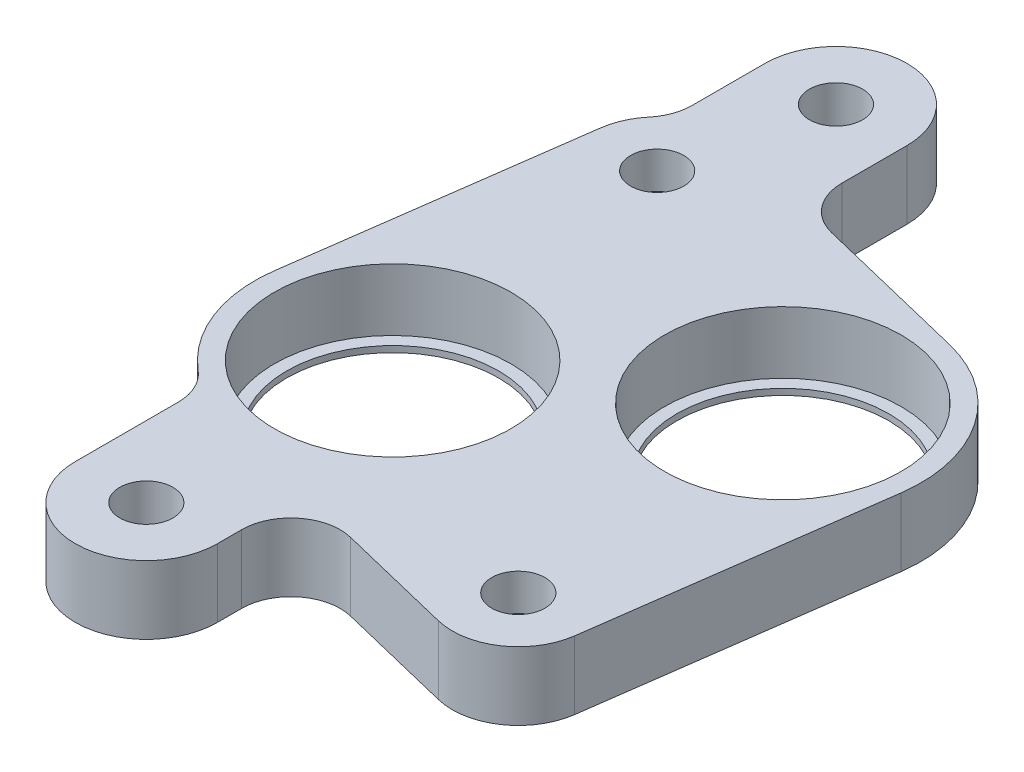
ISO-10303-21;
HEADER;
FILE_DESCRIPTION(('STEP AP214'),'2;1');
FILE_NAME('part.step','',(''),(''),'','','');
FILE_SCHEMA(('AUTOMOTIVE_DESIGN { 1 0 10303 214 1 1 1 1 }'));
ENDSEC;
DATA;
#1=APPLICATION_CONTEXT('core data for automotive mechanical design processes');
#2=APPLICATION_PROTOCOL_DEFINITION('international standard','automotive_design',2000,#1);
#3=PRODUCT_CONTEXT('',#1,'mechanical');
#4=PRODUCT('Part','Part','',(#3));
#5=PRODUCT_RELATED_PRODUCT_CATEGORY('part','',(#4));
#6=PRODUCT_DEFINITION_FORMATION('','',#4);
#7=PRODUCT_DEFINITION_CONTEXT('part definition',#1,'design');
#8=PRODUCT_DEFINITION('design','',#6,#7);
#9=PRODUCT_DEFINITION_SHAPE('','',#8);
#10=(LENGTH_UNIT() NAMED_UNIT(*) SI_UNIT(.MILLI.,.METRE.));
#11=(NAMED_UNIT(*) PLANE_ANGLE_UNIT() SI_UNIT($,.RADIAN.));
#12=(NAMED_UNIT(*) SI_UNIT($,.STERADIAN.) SOLID_ANGLE_UNIT());
#13=UNCERTAINTY_MEASURE_WITH_UNIT(LENGTH_MEASURE(1.E-05),#10,'distance_accuracy_value','');
#14=(GEOMETRIC_REPRESENTATION_CONTEXT(3) GLOBAL_UNCERTAINTY_ASSIGNED_CONTEXT((#13)) GLOBAL_UNIT_ASSIGNED_CONTEXT((#10,
#11,#12)) REPRESENTATION_CONTEXT('',''));
#15=CARTESIAN_POINT('',(0.,0.,0.));
#16=DIRECTION('',(0.,0.,1.));
#17=DIRECTION('',(1.,0.,0.));
#18=AXIS2_PLACEMENT_3D('',#15,#16,#17);
#19=CARTESIAN_POINT('',(-2.06110329687575,53.0765131677119,-19.1105550871349));
#20=DIRECTION('',(0.,-1.,0.));
#21=DIRECTION('',(0.,0.,-1.));
#22=AXIS2_PLACEMENT_3D('',#19,#20,#21);
#23=CYLINDRICAL_SURFACE('',#22,1.7145);
#24=CARTESIAN_POINT('',(-2.06110329687575,4.000000128,-19.1105550871349));
#25=DIRECTION('',(0.,-1.,0.));
#26=DIRECTION('',(0.,0.,-1.));
#27=AXIS2_PLACEMENT_3D('',#24,#25,#26);
#28=CIRCLE('',#27,1.7145);
#29=CARTESIAN_POINT('',(-2.06110329687575,4.000000128,-20.8250550871349));
#30=VERTEX_POINT('',#29);
#31=EDGE_CURVE('E334',#30,#30,#28,.F.);
#32=ORIENTED_EDGE('',*,*,#31,.T.);
#33=EDGE_LOOP('',(#32));
#34=FACE_BOUND('',#33,.T.);
#35=CARTESIAN_POINT('',(-2.06110329687575,1.635125,-19.1105550871349));
#36=DIRECTION('',(0.,-1.,0.));
#37=DIRECTION('',(0.,0.,-1.));
#38=AXIS2_PLACEMENT_3D('',#35,#36,#37);
#39=CIRCLE('',#38,1.7145);
#40=CARTESIAN_POINT('',(-2.06110329687575,1.635125,-20.8250550871349));
#41=VERTEX_POINT('',#40);
#42=EDGE_CURVE('E296',#41,#41,#39,.F.);
#43=ORIENTED_EDGE('',*,*,#42,.F.);
#44=EDGE_LOOP('',(#43));
#45=FACE_BOUND('',#44,.T.);
#46=ADVANCED_FACE('F38',(#34,#45),#23,.F.);
#47=CARTESIAN_POINT('',(17.0236032968758,53.0765131677119,8.92515508713487));
#48=DIRECTION('',(0.,-1.,0.));
#49=DIRECTION('',(0.,0.,-1.));
#50=AXIS2_PLACEMENT_3D('',#47,#48,#49);
#51=CYLINDRICAL_SURFACE('',#50,1.7145);
#52=CARTESIAN_POINT('',(17.0236032968758,4.000000128,8.92515508713487));
#53=DIRECTION('',(0.,-1.,0.));
#54=DIRECTION('',(0.,0.,-1.));
#55=AXIS2_PLACEMENT_3D('',#52,#53,#54);
#56=CIRCLE('',#55,1.7145);
#57=CARTESIAN_POINT('',(17.0236032968758,4.000000128,7.21065508713487));
#58=VERTEX_POINT('',#57);
#59=EDGE_CURVE('E339',#58,#58,#56,.F.);
#60=ORIENTED_EDGE('',*,*,#59,.T.);
#61=EDGE_LOOP('',(#60));
#62=FACE_BOUND('',#61,.T.);
#63=CARTESIAN_POINT('',(17.0236032968758,1.635125,8.92515508713487));
#64=DIRECTION('',(0.,-1.,0.));
#65=DIRECTION('',(0.,0.,-1.));
#66=AXIS2_PLACEMENT_3D('',#63,#64,#65);
#67=CIRCLE('',#66,1.7145);
#68=CARTESIAN_POINT('',(17.0236032968758,1.635125,7.21065508713487));
#69=VERTEX_POINT('',#68);
#70=EDGE_CURVE('E275',#69,#69,#67,.F.);
#71=ORIENTED_EDGE('',*,*,#70,.F.);
#72=EDGE_LOOP('',(#71));
#73=FACE_BOUND('',#72,.T.);
#74=ADVANCED_FACE('F483',(#62,#73),#51,.F.);
#75=CARTESIAN_POINT('',(16.016665053853,53.0765131677119,13.058778875621));
#76=DIRECTION('',(-0.236676047249432,0.,0.971588621103801));
#77=DIRECTION('',(0.971588621103801,0.,0.236676047249432));
#78=AXIS2_PLACEMENT_3D('',#75,#76,#77);
#79=PLANE('',#78);
#80=DIRECTION('',(0.971588621103801,0.,0.236676047249432));
#81=VECTOR('',#80,1.);
#82=CARTESIAN_POINT('',(16.016665053853,4.000000128,13.058778875621));
#83=LINE('',#82,#81);
#84=CARTESIAN_POINT('',(8.50743760526271,4.000000128,11.2295537984374));
#85=VERTEX_POINT('',#84);
#86=CARTESIAN_POINT('',(16.016665053853,4.000000128,13.058778875621));
#87=VERTEX_POINT('',#86);
#88=EDGE_CURVE('E344',#85,#87,#83,.T.);
#89=ORIENTED_EDGE('',*,*,#88,.F.);
#90=DIRECTION('',(0.,-1.,0.));
#91=VECTOR('',#90,1.);
#92=CARTESIAN_POINT('',(8.50743760526271,-0.396874999999998,11.2295537984374));
#93=LINE('',#92,#91);
#94=CARTESIAN_POINT('',(8.50743760526271,-0.396875,11.2295537984374));
#95=VERTEX_POINT('',#94);
#96=EDGE_CURVE('E348',#85,#95,#93,.T.);
#97=ORIENTED_EDGE('',*,*,#96,.T.);
#98=DIRECTION('',(-0.971588621103801,0.,-0.236676047249432));
#99=VECTOR('',#98,1.);
#100=CARTESIAN_POINT('',(16.016665053853,-0.396875,13.058778875621));
#101=LINE('',#100,#99);
#102=CARTESIAN_POINT('',(16.016665053853,-0.396875,13.058778875621));
#103=VERTEX_POINT('',#102);
#104=EDGE_CURVE('E308',#103,#95,#101,.T.);
#105=ORIENTED_EDGE('',*,*,#104,.F.);
#106=DIRECTION('',(0.,-1.,0.));
#107=VECTOR('',#106,1.);
#108=CARTESIAN_POINT('',(16.016665053853,53.0765131677119,13.058778875621));
#109=LINE('',#108,#107);
#110=EDGE_CURVE('E379',#87,#103,#109,.T.);
#111=ORIENTED_EDGE('',*,*,#110,.F.);
#112=EDGE_LOOP('',(#89,#97,#105,#111));
#113=FACE_BOUND('',#112,.T.);
#114=ADVANCED_FACE('F489',(#113),#79,.T.);
#115=CARTESIAN_POINT('',(0.,53.0765131677119,0.));
#116=DIRECTION('',(0.,-1.,0.));
#117=DIRECTION('',(0.,0.,-1.));
#118=AXIS2_PLACEMENT_3D('',#115,#116,#117);
#119=CYLINDRICAL_SURFACE('',#118,8.896999986);
#120=CARTESIAN_POINT('',(0.,-0.396875,0.));
#121=DIRECTION('',(0.,-1.,0.));
#122=DIRECTION('',(0.,0.,-1.));
#123=AXIS2_PLACEMENT_3D('',#120,#121,#122);
#124=CIRCLE('',#123,8.896999986);
#125=CARTESIAN_POINT('',(-5.71612436047576,-0.396875,6.8178098423511));
#126=VERTEX_POINT('',#125);
#127=CARTESIAN_POINT('',(-8.81423844655279,-0.396875,-1.21070614031425));
#128=VERTEX_POINT('',#127);
#129=EDGE_CURVE('E312',#126,#128,#124,.T.);
#130=ORIENTED_EDGE('',*,*,#129,.F.);
#131=DIRECTION('',(0.,-1.,0.));
#132=VECTOR('',#131,1.);
#133=CARTESIAN_POINT('',(-5.71612436047576,53.0765131677119,6.8178098423511));
#134=LINE('',#133,#132);
#135=CARTESIAN_POINT('',(-5.71612436047576,4.000000128,6.8178098423511));
#136=VERTEX_POINT('',#135);
#137=EDGE_CURVE('E420',#126,#136,#134,.F.);
#138=ORIENTED_EDGE('',*,*,#137,.T.);
#139=CARTESIAN_POINT('',(0.,4.000000128,0.));
#140=DIRECTION('',(0.,-1.,0.));
#141=DIRECTION('',(0.,0.,-1.));
#142=AXIS2_PLACEMENT_3D('',#139,#140,#141);
#143=CIRCLE('',#142,8.896999986);
#144=CARTESIAN_POINT('',(-8.81423844655279,4.000000128,-1.21070614031426));
#145=VERTEX_POINT('',#144);
#146=EDGE_CURVE('E352',#145,#136,#143,.F.);
#147=ORIENTED_EDGE('',*,*,#146,.F.);
#148=DIRECTION('',(0.,-1.,0.));
#149=VECTOR('',#148,1.);
#150=CARTESIAN_POINT('',(-8.81423844655279,53.0765131677119,-1.21070614031426));
#151=LINE('',#150,#149);
#152=EDGE_CURVE('E395',#145,#128,#151,.T.);
#153=ORIENTED_EDGE('',*,*,#152,.T.);
#154=EDGE_LOOP('',(#130,#138,#147,#153));
#155=FACE_BOUND('',#154,.T.);
#156=ADVANCED_FACE('F524',(#155),#119,.T.);
#157=CARTESIAN_POINT('',(-6.27602715096902,53.0765131677119,-19.6895085863));
#158=DIRECTION('',(-0.990697815041313,0.,-0.136080267755354));
#159=DIRECTION('',(-0.136080267755354,0.,0.990697815041313));
#160=AXIS2_PLACEMENT_3D('',#157,#158,#159);
#161=PLANE('',#160);
#162=DIRECTION('',(-0.136080267755354,0.,0.990697815041313));
#163=VECTOR('',#162,1.);
#164=CARTESIAN_POINT('',(-6.27602715096902,4.000000128,-19.6895085863));
#165=LINE('',#164,#163);
#166=CARTESIAN_POINT('',(-6.27602715096902,4.000000128,-19.6895085863));
#167=VERTEX_POINT('',#166);
#168=EDGE_CURVE('E356',#167,#145,#165,.T.);
#169=ORIENTED_EDGE('',*,*,#168,.F.);
#170=DIRECTION('',(0.,-1.,0.));
#171=VECTOR('',#170,1.);
#172=CARTESIAN_POINT('',(-6.27602715096902,53.0765131677119,-19.6895085863));
#173=LINE('',#172,#171);
#174=CARTESIAN_POINT('',(-6.27602715096902,-0.396875,-19.6895085863));
#175=VERTEX_POINT('',#174);
#176=EDGE_CURVE('E392',#167,#175,#173,.T.);
#177=ORIENTED_EDGE('',*,*,#176,.T.);
#178=DIRECTION('',(0.136080267755353,0.,-0.990697815041313));
#179=VECTOR('',#178,1.);
#180=CARTESIAN_POINT('',(-8.81423844655279,-0.396875,-1.21070614031425));
#181=LINE('',#180,#179);
#182=EDGE_CURVE('E315',#128,#175,#181,.T.);
#183=ORIENTED_EDGE('',*,*,#182,.F.);
#184=ORIENTED_EDGE('',*,*,#152,.F.);
#185=EDGE_LOOP('',(#169,#177,#183,#184));
#186=FACE_BOUND('',#185,.T.);
#187=ADVANCED_FACE('F520',(#186),#161,.T.);
#188=CARTESIAN_POINT('',(-2.06110329687575,53.0765131677119,-19.1105550871349));
#189=DIRECTION('',(0.,-1.,0.));
#190=DIRECTION('',(0.,0.,-1.));
#191=AXIS2_PLACEMENT_3D('',#188,#189,#190);
#192=CYLINDRICAL_SURFACE('',#191,4.2545);
#193=CARTESIAN_POINT('',(-2.06110329687575,4.000000128,-19.1105550871349));
#194=DIRECTION('',(0.,-1.,0.));
#195=DIRECTION('',(0.,0.,-1.));
#196=AXIS2_PLACEMENT_3D('',#193,#194,#195);
#197=CIRCLE('',#196,4.2545);
#198=CARTESIAN_POINT('',(-5.32227839525858,4.000000128,-21.8428631275446));
#199=VERTEX_POINT('',#198);
#200=EDGE_CURVE('E360',#199,#167,#197,.F.);
#201=ORIENTED_EDGE('',*,*,#200,.F.);
#202=DIRECTION('',(0.,-1.,0.));
#203=VECTOR('',#202,1.);
#204=CARTESIAN_POINT('',(-5.32227839525858,53.0765131677119,-21.8428631275446));
#205=LINE('',#204,#203);
#206=CARTESIAN_POINT('',(-5.32227839525858,-0.396875,-21.8428631275446));
#207=VERTEX_POINT('',#206);
#208=EDGE_CURVE('E429',#199,#207,#205,.T.);
#209=ORIENTED_EDGE('',*,*,#208,.T.);
#210=CARTESIAN_POINT('',(-2.06110329687575,-0.396875,-19.1105550871349));
#211=DIRECTION('',(0.,-1.,0.));
#212=DIRECTION('',(0.,0.,-1.));
#213=AXIS2_PLACEMENT_3D('',#210,#211,#212);
#214=CIRCLE('',#213,4.2545);
#215=EDGE_CURVE('E319',#175,#207,#214,.T.);
#216=ORIENTED_EDGE('',*,*,#215,.F.);
#217=ORIENTED_EDGE('',*,*,#176,.F.);
#218=EDGE_LOOP('',(#201,#209,#216,#217));
#219=FACE_BOUND('',#218,.T.);
#220=ADVANCED_FACE('F516',(#219),#192,.T.);
#221=CARTESIAN_POINT('',(17.0682067890647,53.0765131677119,-18.8296239483583));
#222=DIRECTION('',(0.236676047249432,0.,-0.971588621103801));
#223=DIRECTION('',(-0.971588621103801,0.,-0.236676047249432));
#224=AXIS2_PLACEMENT_3D('',#221,#222,#223);
#225=PLANE('',#224);
#226=DIRECTION('',(0.971588621103801,0.,0.236676047249431));
#227=VECTOR('',#226,1.);
#228=CARTESIAN_POINT('',(-1.05416505385305,-0.396875,-23.244178875621));
#229=LINE('',#228,#227);
#230=CARTESIAN_POINT('',(7.00454470522883,-0.396875,-21.2811015708013));
#231=VERTEX_POINT('',#230);
#232=CARTESIAN_POINT('',(17.0682067890647,-0.396875,-18.8296239483583));
#233=VERTEX_POINT('',#232);
#234=EDGE_CURVE('E322',#231,#233,#229,.T.);
#235=ORIENTED_EDGE('',*,*,#234,.F.);
#236=DIRECTION('',(0.,-1.,0.));
#237=VECTOR('',#236,1.);
#238=CARTESIAN_POINT('',(7.00454470522883,4.000000128,-21.2811015708013));
#239=LINE('',#238,#237);
#240=CARTESIAN_POINT('',(7.00454470522883,4.000000128,-21.2811015708013));
#241=VERTEX_POINT('',#240);
#242=EDGE_CURVE('E427',#231,#241,#239,.F.);
#243=ORIENTED_EDGE('',*,*,#242,.T.);
#244=DIRECTION('',(-0.971588621103801,0.,-0.236676047249432));
#245=VECTOR('',#244,1.);
#246=CARTESIAN_POINT('',(17.0682067890647,4.000000128,-18.8296239483583));
#247=LINE('',#246,#245);
#248=CARTESIAN_POINT('',(17.0682067890647,4.000000128,-18.8296239483583));
#249=VERTEX_POINT('',#248);
#250=EDGE_CURVE('E363',#249,#241,#247,.T.);
#251=ORIENTED_EDGE('',*,*,#250,.F.);
#252=DIRECTION('',(0.,-1.,0.));
#253=VECTOR('',#252,1.);
#254=CARTESIAN_POINT('',(17.0682067890647,53.0765131677119,-18.8296239483583));
#255=LINE('',#254,#253);
#256=EDGE_CURVE('E388',#249,#233,#255,.T.);
#257=ORIENTED_EDGE('',*,*,#256,.T.);
#258=EDGE_LOOP('',(#235,#243,#251,#257));
#259=FACE_BOUND('',#258,.T.);
#260=ADVANCED_FACE('F512',(#259),#225,.T.);
#261=CARTESIAN_POINT('',(14.9625,53.0765131677119,-10.1854));
#262=DIRECTION('',(0.,-1.,0.));
#263=DIRECTION('',(0.,0.,-1.));
#264=AXIS2_PLACEMENT_3D('',#261,#262,#263);
#265=CYLINDRICAL_SURFACE('',#264,8.896999986);
#266=CARTESIAN_POINT('',(14.9625,4.000000128,-10.1854));
#267=DIRECTION('',(0.,-1.,0.));
#268=DIRECTION('',(0.,0.,-1.));
#269=AXIS2_PLACEMENT_3D('',#266,#267,#268);
#270=CIRCLE('',#269,8.896999986);
#271=CARTESIAN_POINT('',(23.7767384465528,4.000000128,-8.97469385968575));
#272=VERTEX_POINT('',#271);
#273=EDGE_CURVE('E367',#272,#249,#270,.F.);
#274=ORIENTED_EDGE('',*,*,#273,.F.);
#275=DIRECTION('',(0.,-1.,0.));
#276=VECTOR('',#275,1.);
#277=CARTESIAN_POINT('',(23.7767384465528,53.0765131677119,-8.97469385968575));
#278=LINE('',#277,#276);
#279=CARTESIAN_POINT('',(23.7767384465528,-0.396875,-8.97469385968575));
#280=VERTEX_POINT('',#279);
#281=EDGE_CURVE('E385',#272,#280,#278,.T.);
#282=ORIENTED_EDGE('',*,*,#281,.T.);
#283=CARTESIAN_POINT('',(14.9625,-0.396875,-10.1854));
#284=DIRECTION('',(0.,-1.,0.));
#285=DIRECTION('',(0.,0.,-1.));
#286=AXIS2_PLACEMENT_3D('',#283,#284,#285);
#287=CIRCLE('',#286,8.896999986);
#288=EDGE_CURVE('E325',#233,#280,#287,.T.);
#289=ORIENTED_EDGE('',*,*,#288,.F.);
#290=ORIENTED_EDGE('',*,*,#256,.F.);
#291=EDGE_LOOP('',(#274,#282,#289,#290));
#292=FACE_BOUND('',#291,.T.);
#293=ADVANCED_FACE('F508',(#292),#265,.T.);
#294=CARTESIAN_POINT('',(21.238527150969,53.0765131677119,9.50410858630002));
#295=DIRECTION('',(0.990697815041313,0.,0.136080267755353));
#296=DIRECTION('',(0.136080267755353,0.,-0.990697815041313));
#297=AXIS2_PLACEMENT_3D('',#294,#295,#296);
#298=PLANE('',#297);
#299=DIRECTION('',(0.136080267755353,0.,-0.990697815041313));
#300=VECTOR('',#299,1.);
#301=CARTESIAN_POINT('',(21.238527150969,4.000000128,9.50410858630002));
#302=LINE('',#301,#300);
#303=CARTESIAN_POINT('',(21.238527150969,4.000000128,9.50410858630002));
#304=VERTEX_POINT('',#303);
#305=EDGE_CURVE('E370',#304,#272,#302,.T.);
#306=ORIENTED_EDGE('',*,*,#305,.F.);
#307=DIRECTION('',(0.,-1.,0.));
#308=VECTOR('',#307,1.);
#309=CARTESIAN_POINT('',(21.238527150969,53.0765131677119,9.50410858630002));
#310=LINE('',#309,#308);
#311=CARTESIAN_POINT('',(21.238527150969,-0.396875,9.50410858630002));
#312=VERTEX_POINT('',#311);
#313=EDGE_CURVE('E357',#304,#312,#310,.T.);
#314=ORIENTED_EDGE('',*,*,#313,.T.);
#315=DIRECTION('',(-0.136080267755353,0.,0.990697815041313));
#316=VECTOR('',#315,1.);
#317=CARTESIAN_POINT('',(23.7767384465528,-0.396875,-8.97469385968575));
#318=LINE('',#317,#316);
#319=EDGE_CURVE('E329',#280,#312,#318,.T.);
#320=ORIENTED_EDGE('',*,*,#319,.F.);
#321=ORIENTED_EDGE('',*,*,#281,.F.);
#322=EDGE_LOOP('',(#306,#314,#320,#321));
#323=FACE_BOUND('',#322,.T.);
#324=ADVANCED_FACE('F505',(#323),#298,.T.);
#325=CARTESIAN_POINT('',(17.0236032968758,53.0765131677119,8.92515508713487));
#326=DIRECTION('',(0.,-1.,0.));
#327=DIRECTION('',(0.,0.,-1.));
#328=AXIS2_PLACEMENT_3D('',#325,#326,#327);
#329=CYLINDRICAL_SURFACE('',#328,4.2545);
#330=CARTESIAN_POINT('',(17.0236032968758,4.000000128,8.92515508713487));
#331=DIRECTION('',(0.,-1.,0.));
#332=DIRECTION('',(0.,0.,-1.));
#333=AXIS2_PLACEMENT_3D('',#330,#331,#332);
#334=CIRCLE('',#333,4.2545);
#335=EDGE_CURVE('E351',#87,#304,#334,.F.);
#336=ORIENTED_EDGE('',*,*,#335,.F.);
#337=ORIENTED_EDGE('',*,*,#110,.T.);
#338=CARTESIAN_POINT('',(17.0236032968758,-0.396875,8.92515508713487));
#339=DIRECTION('',(0.,-1.,0.));
#340=DIRECTION('',(0.,0.,-1.));
#341=AXIS2_PLACEMENT_3D('',#338,#339,#340);
#342=CIRCLE('',#341,4.2545);
#343=EDGE_CURVE('E301',#312,#103,#342,.T.);
#344=ORIENTED_EDGE('',*,*,#343,.F.);
#345=ORIENTED_EDGE('',*,*,#313,.F.);
#346=EDGE_LOOP('',(#336,#337,#344,#345));
#347=FACE_BOUND('',#346,.T.);
#348=ADVANCED_FACE('F503',(#347),#329,.T.);
#349=CARTESIAN_POINT('',(14.9625,53.0765131677119,-10.1854));
#350=DIRECTION('',(0.,-1.,0.));
#351=DIRECTION('',(0.,0.,-1.));
#352=AXIS2_PLACEMENT_3D('',#349,#350,#351);
#353=CYLINDRICAL_SURFACE('',#352,7.626999986);
#354=CARTESIAN_POINT('',(14.9625,4.000000128,-10.1854));
#355=DIRECTION('',(0.,-1.,0.));
#356=DIRECTION('',(0.,0.,-1.));
#357=AXIS2_PLACEMENT_3D('',#354,#355,#356);
#358=CIRCLE('',#357,7.626999986);
#359=CARTESIAN_POINT('',(14.9625,4.000000128,-17.812399986));
#360=VERTEX_POINT('',#359);
#361=EDGE_CURVE('E338',#360,#360,#358,.F.);
#362=ORIENTED_EDGE('',*,*,#361,.T.);
#363=EDGE_LOOP('',(#362));
#364=FACE_BOUND('',#363,.T.);
#365=CARTESIAN_POINT('',(14.9625,0.,-10.1854));
#366=DIRECTION('',(0.,-1.,0.));
#367=DIRECTION('',(0.,0.,-1.));
#368=AXIS2_PLACEMENT_3D('',#365,#366,#367);
#369=CIRCLE('',#368,7.626999986);
#370=CARTESIAN_POINT('',(14.9625,0.,-17.812399986));
#371=VERTEX_POINT('',#370);
#372=EDGE_CURVE('E333',#371,#371,#369,.T.);
#373=ORIENTED_EDGE('',*,*,#372,.T.);
#374=EDGE_LOOP('',(#373));
#375=FACE_BOUND('',#374,.T.);
#376=ADVANCED_FACE('F499',(#364,#375),#353,.F.);
#377=CARTESIAN_POINT('',(0.,53.0765131677119,0.));
#378=DIRECTION('',(0.,-1.,0.));
#379=DIRECTION('',(0.,0.,-1.));
#380=AXIS2_PLACEMENT_3D('',#377,#378,#379);
#381=CYLINDRICAL_SURFACE('',#380,7.626999986);
#382=CARTESIAN_POINT('',(0.,4.000000128,0.));
#383=DIRECTION('',(0.,-1.,0.));
#384=DIRECTION('',(0.,0.,-1.));
#385=AXIS2_PLACEMENT_3D('',#382,#383,#384);
#386=CIRCLE('',#385,7.626999986);
#387=CARTESIAN_POINT('',(0.,4.000000128,-7.626999986));
#388=VERTEX_POINT('',#387);
#389=EDGE_CURVE('E340',#388,#388,#386,.F.);
#390=ORIENTED_EDGE('',*,*,#389,.T.);
#391=EDGE_LOOP('',(#390));
#392=FACE_BOUND('',#391,.T.);
#393=CARTESIAN_POINT('',(0.,0.,0.));
#394=DIRECTION('',(0.,-1.,0.));
#395=DIRECTION('',(0.,0.,-1.));
#396=AXIS2_PLACEMENT_3D('',#393,#394,#395);
#397=CIRCLE('',#396,7.626999986);
#398=CARTESIAN_POINT('',(0.,0.,-7.626999986));
#399=VERTEX_POINT('',#398);
#400=EDGE_CURVE('E375',#399,#399,#397,.T.);
#401=ORIENTED_EDGE('',*,*,#400,.T.);
#402=EDGE_LOOP('',(#401));
#403=FACE_BOUND('',#402,.T.);
#404=ADVANCED_FACE('F495',(#392,#403),#381,.F.);
#405=CARTESIAN_POINT('',(0.,4.000000128,0.));
#406=DIRECTION('',(0.,-1.,0.));
#407=DIRECTION('',(0.,0.,-1.));
#408=AXIS2_PLACEMENT_3D('',#405,#406,#407);
#409=PLANE('',#408);
#410=ORIENTED_EDGE('',*,*,#250,.T.);
#411=CARTESIAN_POINT('',(7.75599115524578,4.000000128,-24.3658954428059));
#412=DIRECTION('',(0.,-1.,0.));
#413=DIRECTION('',(0.,0.,-1.));
#414=AXIS2_PLACEMENT_3D('',#411,#412,#413);
#415=CIRCLE('',#414,3.175);
#416=CARTESIAN_POINT('',(4.58099115524578,4.000000128,-24.3658954428059));
#417=VERTEX_POINT('',#416);
#418=EDGE_CURVE('E450',#241,#417,#415,.T.);
#419=ORIENTED_EDGE('',*,*,#418,.T.);
#420=DIRECTION('',(0.,0.,-1.));
#421=VECTOR('',#420,1.);
#422=CARTESIAN_POINT('',(4.58099115524578,4.000000128,-21.871471879848));
#423=LINE('',#422,#421);
#424=CARTESIAN_POINT('',(4.58099115524578,4.000000128,-28.575));
#425=VERTEX_POINT('',#424);
#426=EDGE_CURVE('E454',#417,#425,#423,.T.);
#427=ORIENTED_EDGE('',*,*,#426,.T.);
#428=CARTESIAN_POINT('',(0.,4.000000128,-28.575));
#429=DIRECTION('',(0.,-1.,0.));
#430=DIRECTION('',(0.,0.,-1.));
#431=AXIS2_PLACEMENT_3D('',#428,#429,#430);
#432=CIRCLE('',#431,4.58099115524577);
#433=CARTESIAN_POINT('',(-4.58099115524576,4.000000128,-28.575));
#434=VERTEX_POINT('',#433);
#435=EDGE_CURVE('E228',#425,#434,#432,.F.);
#436=ORIENTED_EDGE('',*,*,#435,.T.);
#437=DIRECTION('',(0.,0.,1.));
#438=VECTOR('',#437,1.);
#439=CARTESIAN_POINT('',(-4.58099115524577,4.000000128,-22.5385188312896));
#440=LINE('',#439,#438);
#441=CARTESIAN_POINT('',(-4.58099115524577,4.000000128,-23.8818989785967));
#442=VERTEX_POINT('',#441);
#443=EDGE_CURVE('E210',#434,#442,#440,.T.);
#444=ORIENTED_EDGE('',*,*,#443,.T.);
#445=CARTESIAN_POINT('',(-7.75599115524577,4.000000128,-23.8818989785967));
#446=DIRECTION('',(0.,-1.,0.));
#447=DIRECTION('',(0.,0.,-1.));
#448=AXIS2_PLACEMENT_3D('',#445,#446,#447);
#449=CIRCLE('',#448,3.175);
#450=EDGE_CURVE('E11',#442,#199,#449,.T.);
#451=ORIENTED_EDGE('',*,*,#450,.T.);
#452=ORIENTED_EDGE('',*,*,#200,.T.);
#453=ORIENTED_EDGE('',*,*,#168,.T.);
#454=ORIENTED_EDGE('',*,*,#146,.T.);
#455=CARTESIAN_POINT('',(-7.75599115524576,4.000000128,9.25082617184722));
#456=DIRECTION('',(0.,-1.,0.));
#457=DIRECTION('',(0.,0.,-1.));
#458=AXIS2_PLACEMENT_3D('',#455,#456,#457);
#459=CIRCLE('',#458,3.175);
#460=CARTESIAN_POINT('',(-4.58099115524576,4.000000128,9.25082617184722));
#461=VERTEX_POINT('',#460);
#462=EDGE_CURVE('E444',#136,#461,#459,.T.);
#463=ORIENTED_EDGE('',*,*,#462,.T.);
#464=DIRECTION('',(0.,0.,1.));
#465=VECTOR('',#464,1.);
#466=CARTESIAN_POINT('',(-4.58099115524576,4.000000128,7.626999986));
#467=LINE('',#466,#465);
#468=CARTESIAN_POINT('',(-4.58099115524576,4.000000128,15.875));
#469=VERTEX_POINT('',#468);
#470=EDGE_CURVE('E243',#461,#469,#467,.T.);
#471=ORIENTED_EDGE('',*,*,#470,.T.);
#472=CARTESIAN_POINT('',(0.,4.000000128,15.875));
#473=DIRECTION('',(0.,-1.,0.));
#474=DIRECTION('',(0.,0.,-1.));
#475=AXIS2_PLACEMENT_3D('',#472,#473,#474);
#476=CIRCLE('',#475,4.58099115524576);
#477=CARTESIAN_POINT('',(4.58099115524576,4.000000128,15.875));
#478=VERTEX_POINT('',#477);
#479=EDGE_CURVE('E239',#469,#478,#476,.F.);
#480=ORIENTED_EDGE('',*,*,#479,.T.);
#481=DIRECTION('',(0.,0.,-1.));
#482=VECTOR('',#481,1.);
#483=CARTESIAN_POINT('',(4.58099115524578,4.000000128,10.2730833279714));
#484=LINE('',#483,#482);
#485=CARTESIAN_POINT('',(4.58099115524577,4.000000128,14.314347670442));
#486=VERTEX_POINT('',#485);
#487=EDGE_CURVE('E235',#478,#486,#484,.T.);
#488=ORIENTED_EDGE('',*,*,#487,.T.);
#489=CARTESIAN_POINT('',(7.75599115524577,4.000000128,14.314347670442));
#490=DIRECTION('',(0.,-1.,0.));
#491=DIRECTION('',(0.,0.,-1.));
#492=AXIS2_PLACEMENT_3D('',#489,#490,#491);
#493=CIRCLE('',#492,3.175);
#494=EDGE_CURVE('E438',#486,#85,#493,.T.);
#495=ORIENTED_EDGE('',*,*,#494,.T.);
#496=ORIENTED_EDGE('',*,*,#88,.T.);
#497=ORIENTED_EDGE('',*,*,#335,.T.);
#498=ORIENTED_EDGE('',*,*,#305,.T.);
#499=ORIENTED_EDGE('',*,*,#273,.T.);
#500=EDGE_LOOP('',(#410,#419,#427,#436,#444,#451,#452,#453,#454,#463,#471,#480,#488,#495,#496,
#497,#498,#499));
#501=FACE_BOUND('',#500,.T.);
#502=ORIENTED_EDGE('',*,*,#389,.F.);
#503=EDGE_LOOP('',(#502));
#504=FACE_BOUND('',#503,.T.);
#505=ORIENTED_EDGE('',*,*,#59,.F.);
#506=EDGE_LOOP('',(#505));
#507=FACE_BOUND('',#506,.T.);
#508=ORIENTED_EDGE('',*,*,#31,.F.);
#509=EDGE_LOOP('',(#508));
#510=FACE_BOUND('',#509,.T.);
#511=ORIENTED_EDGE('',*,*,#361,.F.);
#512=EDGE_LOOP('',(#511));
#513=FACE_BOUND('',#512,.T.);
#514=CARTESIAN_POINT('',(0.,4.000000128,15.875));
#515=DIRECTION('',(0.,-1.,0.));
#516=DIRECTION('',(0.,0.,-1.));
#517=AXIS2_PLACEMENT_3D('',#514,#515,#516);
#518=CIRCLE('',#517,1.7145);
#519=CARTESIAN_POINT('',(0.,4.000000128,14.1605));
#520=VERTEX_POINT('',#519);
#521=EDGE_CURVE('E246',#520,#520,#518,.F.);
#522=ORIENTED_EDGE('',*,*,#521,.F.);
#523=EDGE_LOOP('',(#522));
#524=FACE_BOUND('',#523,.T.);
#525=CARTESIAN_POINT('',(0.,4.000000128,-28.575));
#526=DIRECTION('',(0.,-1.,0.));
#527=DIRECTION('',(0.,0.,-1.));
#528=AXIS2_PLACEMENT_3D('',#525,#526,#527);
#529=CIRCLE('',#528,1.7145);
#530=CARTESIAN_POINT('',(0.,4.000000128,-30.2895));
#531=VERTEX_POINT('',#530);
#532=EDGE_CURVE('E230',#531,#531,#529,.F.);
#533=ORIENTED_EDGE('',*,*,#532,.F.);
#534=EDGE_LOOP('',(#533));
#535=FACE_BOUND('',#534,.T.);
#536=ADVANCED_FACE('F498',(#501,#504,#507,#510,#513,#524,#535),#409,.F.);
#537=CARTESIAN_POINT('',(0.,-0.396875,0.));
#538=DIRECTION('',(0.,1.,0.));
#539=DIRECTION('',(0.,0.,1.));
#540=AXIS2_PLACEMENT_3D('',#537,#538,#539);
#541=CYLINDRICAL_SURFACE('',#540,6.833249986);
#542=CARTESIAN_POINT('',(0.,-0.396875,0.));
#543=DIRECTION('',(0.,-1.,0.));
#544=DIRECTION('',(0.,0.,-1.));
#545=AXIS2_PLACEMENT_3D('',#542,#543,#544);
#546=CIRCLE('',#545,6.833249986);
#547=CARTESIAN_POINT('',(0.,-0.396875,-6.833249986));
#548=VERTEX_POINT('',#547);
#549=EDGE_CURVE('E287',#548,#548,#546,.T.);
#550=ORIENTED_EDGE('',*,*,#549,.T.);
#551=EDGE_LOOP('',(#550));
#552=FACE_BOUND('',#551,.T.);
#553=CARTESIAN_POINT('',(0.,0.,0.));
#554=DIRECTION('',(0.,-1.,0.));
#555=DIRECTION('',(0.,0.,-1.));
#556=AXIS2_PLACEMENT_3D('',#553,#554,#555);
#557=CIRCLE('',#556,6.833249986);
#558=CARTESIAN_POINT('',(0.,0.,-6.833249986));
#559=VERTEX_POINT('',#558);
#560=EDGE_CURVE('E292',#559,#559,#557,.T.);
#561=ORIENTED_EDGE('',*,*,#560,.F.);
#562=EDGE_LOOP('',(#561));
#563=FACE_BOUND('',#562,.T.);
#564=ADVANCED_FACE('F479',(#552,#563),#541,.F.);
#565=CARTESIAN_POINT('',(14.9625,-0.396875,-10.1854));
#566=DIRECTION('',(0.,1.,0.));
#567=DIRECTION('',(0.,0.,1.));
#568=AXIS2_PLACEMENT_3D('',#565,#566,#567);
#569=CYLINDRICAL_SURFACE('',#568,6.833249986);
#570=CARTESIAN_POINT('',(14.9625,-0.396875,-10.1854));
#571=DIRECTION('',(0.,-1.,0.));
#572=DIRECTION('',(0.,0.,-1.));
#573=AXIS2_PLACEMENT_3D('',#570,#571,#572);
#574=CIRCLE('',#573,6.833249986);
#575=CARTESIAN_POINT('',(14.9625,-0.396875,-17.018649986));
#576=VERTEX_POINT('',#575);
#577=EDGE_CURVE('E297',#576,#576,#574,.T.);
#578=ORIENTED_EDGE('',*,*,#577,.T.);
#579=EDGE_LOOP('',(#578));
#580=FACE_BOUND('',#579,.T.);
#581=CARTESIAN_POINT('',(14.9625,0.,-10.1854));
#582=DIRECTION('',(0.,-1.,0.));
#583=DIRECTION('',(0.,0.,-1.));
#584=AXIS2_PLACEMENT_3D('',#581,#582,#583);
#585=CIRCLE('',#584,6.833249986);
#586=CARTESIAN_POINT('',(14.9625,0.,-17.018649986));
#587=VERTEX_POINT('',#586);
#588=EDGE_CURVE('E291',#587,#587,#585,.T.);
#589=ORIENTED_EDGE('',*,*,#588,.F.);
#590=EDGE_LOOP('',(#589));
#591=FACE_BOUND('',#590,.T.);
#592=ADVANCED_FACE('F470',(#580,#591),#569,.F.);
#593=CARTESIAN_POINT('',(17.0236032968758,-0.396875,8.92515508713487));
#594=DIRECTION('',(0.,-1.,0.));
#595=DIRECTION('',(0.,0.,-1.));
#596=AXIS2_PLACEMENT_3D('',#593,#594,#595);
#597=PLANE('',#596);
#598=DIRECTION('',(0.,0.,1.));
#599=VECTOR('',#598,1.);
#600=CARTESIAN_POINT('',(4.58099115524578,-0.396875,-21.871471879848));
#601=LINE('',#600,#599);
#602=CARTESIAN_POINT('',(4.58099115524578,-0.396875,-28.575));
#603=VERTEX_POINT('',#602);
#604=CARTESIAN_POINT('',(4.58099115524578,-0.396875,-24.3658954428059));
#605=VERTEX_POINT('',#604);
#606=EDGE_CURVE('E215',#603,#605,#601,.T.);
#607=ORIENTED_EDGE('',*,*,#606,.T.);
#608=CARTESIAN_POINT('',(7.75599115524578,-0.396875000000001,-24.3658954428059));
#609=DIRECTION('',(0.,-1.,0.));
#610=DIRECTION('',(0.,0.,-1.));
#611=AXIS2_PLACEMENT_3D('',#608,#609,#610);
#612=CIRCLE('',#611,3.175);
#613=EDGE_CURVE('E447',#605,#231,#612,.F.);
#614=ORIENTED_EDGE('',*,*,#613,.T.);
#615=ORIENTED_EDGE('',*,*,#234,.T.);
#616=ORIENTED_EDGE('',*,*,#288,.T.);
#617=ORIENTED_EDGE('',*,*,#319,.T.);
#618=ORIENTED_EDGE('',*,*,#343,.T.);
#619=ORIENTED_EDGE('',*,*,#104,.T.);
#620=CARTESIAN_POINT('',(7.75599115524577,-0.396874999999998,14.314347670442));
#621=DIRECTION('',(0.,-1.,0.));
#622=DIRECTION('',(0.,0.,-1.));
#623=AXIS2_PLACEMENT_3D('',#620,#621,#622);
#624=CIRCLE('',#623,3.175);
#625=CARTESIAN_POINT('',(4.58099115524577,-0.396875,14.314347670442));
#626=VERTEX_POINT('',#625);
#627=EDGE_CURVE('E435',#95,#626,#624,.F.);
#628=ORIENTED_EDGE('',*,*,#627,.T.);
#629=DIRECTION('',(0.,0.,1.));
#630=VECTOR('',#629,1.);
#631=CARTESIAN_POINT('',(4.58099115524578,-0.396875,10.2730833279714));
#632=LINE('',#631,#630);
#633=CARTESIAN_POINT('',(4.58099115524576,-0.396875,15.875));
#634=VERTEX_POINT('',#633);
#635=EDGE_CURVE('E250',#626,#634,#632,.T.);
#636=ORIENTED_EDGE('',*,*,#635,.T.);
#637=CARTESIAN_POINT('',(0.,-0.396875,15.875));
#638=DIRECTION('',(0.,-1.,0.));
#639=DIRECTION('',(0.,0.,-1.));
#640=AXIS2_PLACEMENT_3D('',#637,#638,#639);
#641=CIRCLE('',#640,4.58099115524576);
#642=CARTESIAN_POINT('',(-4.58099115524576,-0.396875,15.875));
#643=VERTEX_POINT('',#642);
#644=EDGE_CURVE('E253',#634,#643,#641,.T.);
#645=ORIENTED_EDGE('',*,*,#644,.T.);
#646=DIRECTION('',(0.,0.,-1.));
#647=VECTOR('',#646,1.);
#648=CARTESIAN_POINT('',(-4.58099115524576,-0.396875,7.626999986));
#649=LINE('',#648,#647);
#650=CARTESIAN_POINT('',(-4.58099115524576,-0.396875,9.25082617184722));
#651=VERTEX_POINT('',#650);
#652=EDGE_CURVE('E257',#643,#651,#649,.T.);
#653=ORIENTED_EDGE('',*,*,#652,.T.);
#654=CARTESIAN_POINT('',(-7.75599115524576,-0.396874999999998,9.25082617184722));
#655=DIRECTION('',(0.,-1.,0.));
#656=DIRECTION('',(0.,0.,-1.));
#657=AXIS2_PLACEMENT_3D('',#654,#655,#656);
#658=CIRCLE('',#657,3.175);
#659=EDGE_CURVE('E441',#651,#126,#658,.F.);
#660=ORIENTED_EDGE('',*,*,#659,.T.);
#661=ORIENTED_EDGE('',*,*,#129,.T.);
#662=ORIENTED_EDGE('',*,*,#182,.T.);
#663=ORIENTED_EDGE('',*,*,#215,.T.);
#664=CARTESIAN_POINT('',(-7.75599115524577,-0.396874999999998,-23.8818989785967));
#665=DIRECTION('',(0.,-1.,0.));
#666=DIRECTION('',(0.,0.,-1.));
#667=AXIS2_PLACEMENT_3D('',#664,#665,#666);
#668=CIRCLE('',#667,3.175);
#669=CARTESIAN_POINT('',(-4.58099115524577,-0.396875,-23.8818989785967));
#670=VERTEX_POINT('',#669);
#671=EDGE_CURVE('E47',#207,#670,#668,.F.);
#672=ORIENTED_EDGE('',*,*,#671,.T.);
#673=DIRECTION('',(0.,0.,-1.));
#674=VECTOR('',#673,1.);
#675=CARTESIAN_POINT('',(-4.58099115524577,-0.396875,-22.5385188312896));
#676=LINE('',#675,#674);
#677=CARTESIAN_POINT('',(-4.58099115524576,-0.396875,-28.575));
#678=VERTEX_POINT('',#677);
#679=EDGE_CURVE('E197',#670,#678,#676,.T.);
#680=ORIENTED_EDGE('',*,*,#679,.T.);
#681=CARTESIAN_POINT('',(0.,-0.396875,-28.575));
#682=DIRECTION('',(0.,-1.,0.));
#683=DIRECTION('',(0.,0.,-1.));
#684=AXIS2_PLACEMENT_3D('',#681,#682,#683);
#685=CIRCLE('',#684,4.58099115524577);
#686=EDGE_CURVE('E203',#678,#603,#685,.T.);
#687=ORIENTED_EDGE('',*,*,#686,.T.);
#688=EDGE_LOOP('',(#607,#614,#615,#616,#617,#618,#619,#628,#636,#645,#653,#660,#661,#662,#663,
#672,#680,#687));
#689=FACE_BOUND('',#688,.T.);
#690=CARTESIAN_POINT('',(17.0236032968758,-0.396875,8.92515508713487));
#691=DIRECTION('',(0.,-1.,0.));
#692=DIRECTION('',(0.,0.,-1.));
#693=AXIS2_PLACEMENT_3D('',#690,#691,#692);
#694=CIRCLE('',#693,2.794);
#695=CARTESIAN_POINT('',(17.0236032968758,-0.396875,6.13115508713487));
#696=VERTEX_POINT('',#695);
#697=EDGE_CURVE('E276',#696,#696,#694,.T.);
#698=ORIENTED_EDGE('',*,*,#697,.F.);
#699=EDGE_LOOP('',(#698));
#700=FACE_BOUND('',#699,.T.);
#701=CARTESIAN_POINT('',(-2.06110329687575,-0.396875,-19.1105550871349));
#702=DIRECTION('',(0.,-1.,0.));
#703=DIRECTION('',(0.,0.,-1.));
#704=AXIS2_PLACEMENT_3D('',#701,#702,#703);
#705=CIRCLE('',#704,2.794);
#706=CARTESIAN_POINT('',(-2.06110329687575,-0.396875,-21.9045550871349));
#707=VERTEX_POINT('',#706);
#708=EDGE_CURVE('E270',#707,#707,#705,.T.);
#709=ORIENTED_EDGE('',*,*,#708,.F.);
#710=EDGE_LOOP('',(#709));
#711=FACE_BOUND('',#710,.T.);
#712=ORIENTED_EDGE('',*,*,#577,.F.);
#713=EDGE_LOOP('',(#712));
#714=FACE_BOUND('',#713,.T.);
#715=ORIENTED_EDGE('',*,*,#549,.F.);
#716=EDGE_LOOP('',(#715));
#717=FACE_BOUND('',#716,.T.);
#718=CARTESIAN_POINT('',(0.,-0.396875,15.875));
#719=DIRECTION('',(0.,-1.,0.));
#720=DIRECTION('',(0.,0.,-1.));
#721=AXIS2_PLACEMENT_3D('',#718,#719,#720);
#722=CIRCLE('',#721,1.7145);
#723=CARTESIAN_POINT('',(0.,-0.396875,14.1605));
#724=VERTEX_POINT('',#723);
#725=EDGE_CURVE('E234',#724,#724,#722,.T.);
#726=ORIENTED_EDGE('',*,*,#725,.F.);
#727=EDGE_LOOP('',(#726));
#728=FACE_BOUND('',#727,.T.);
#729=CARTESIAN_POINT('',(0.,-0.396875,-28.575));
#730=DIRECTION('',(0.,-1.,0.));
#731=DIRECTION('',(0.,0.,-1.));
#732=AXIS2_PLACEMENT_3D('',#729,#730,#731);
#733=CIRCLE('',#732,1.7145);
#734=CARTESIAN_POINT('',(0.,-0.396875,-30.2895));
#735=VERTEX_POINT('',#734);
#736=EDGE_CURVE('E205',#735,#735,#733,.T.);
#737=ORIENTED_EDGE('',*,*,#736,.F.);
#738=EDGE_LOOP('',(#737));
#739=FACE_BOUND('',#738,.T.);
#740=ADVANCED_FACE('F200',(#689,#700,#711,#714,#717,#728,#739),#597,.T.);
#741=CARTESIAN_POINT('',(17.0236032968758,0.,8.92515508713487));
#742=DIRECTION('',(0.,-1.,0.));
#743=DIRECTION('',(0.,0.,-1.));
#744=AXIS2_PLACEMENT_3D('',#741,#742,#743);
#745=PLANE('',#744);
#746=ORIENTED_EDGE('',*,*,#588,.T.);
#747=EDGE_LOOP('',(#746));
#748=FACE_BOUND('',#747,.T.);
#749=ORIENTED_EDGE('',*,*,#372,.F.);
#750=EDGE_LOOP('',(#749));
#751=FACE_BOUND('',#750,.T.);
#752=ADVANCED_FACE('F469',(#748,#751),#745,.F.);
#753=ORIENTED_EDGE('',*,*,#560,.T.);
#754=EDGE_LOOP('',(#753));
#755=FACE_BOUND('',#754,.T.);
#756=ORIENTED_EDGE('',*,*,#400,.F.);
#757=EDGE_LOOP('',(#756));
#758=FACE_BOUND('',#757,.T.);
#759=ADVANCED_FACE('F476',(#755,#758),#745,.F.);
#760=CARTESIAN_POINT('',(-2.06110329687575,1.635125,-19.1105550871349));
#761=DIRECTION('',(0.,-1.,0.));
#762=DIRECTION('',(0.,0.,-1.));
#763=AXIS2_PLACEMENT_3D('',#760,#761,#762);
#764=PLANE('',#763);
#765=CARTESIAN_POINT('',(-2.06110329687575,1.635125,-19.1105550871349));
#766=DIRECTION('',(0.,-1.,0.));
#767=DIRECTION('',(0.,0.,-1.));
#768=AXIS2_PLACEMENT_3D('',#765,#766,#767);
#769=CIRCLE('',#768,2.794);
#770=CARTESIAN_POINT('',(-2.06110329687575,1.635125,-21.9045550871349));
#771=VERTEX_POINT('',#770);
#772=EDGE_CURVE('E280',#771,#771,#769,.T.);
#773=ORIENTED_EDGE('',*,*,#772,.T.);
#774=EDGE_LOOP('',(#773));
#775=FACE_BOUND('',#774,.T.);
#776=ORIENTED_EDGE('',*,*,#42,.T.);
#777=EDGE_LOOP('',(#776));
#778=FACE_BOUND('',#777,.T.);
#779=ADVANCED_FACE('F622',(#775,#778),#764,.T.);
#780=CARTESIAN_POINT('',(-2.06110329687575,1.635125,-19.1105550871349));
#781=DIRECTION('',(0.,-1.,0.));
#782=DIRECTION('',(0.,0.,-1.));
#783=AXIS2_PLACEMENT_3D('',#780,#781,#782);
#784=CYLINDRICAL_SURFACE('',#783,2.794);
#785=ORIENTED_EDGE('',*,*,#772,.F.);
#786=EDGE_LOOP('',(#785));
#787=FACE_BOUND('',#786,.T.);
#788=ORIENTED_EDGE('',*,*,#708,.T.);
#789=EDGE_LOOP('',(#788));
#790=FACE_BOUND('',#789,.T.);
#791=ADVANCED_FACE('F617',(#787,#790),#784,.F.);
#792=CARTESIAN_POINT('',(17.0236032968758,1.635125,8.92515508713487));
#793=DIRECTION('',(0.,-1.,0.));
#794=DIRECTION('',(0.,0.,-1.));
#795=AXIS2_PLACEMENT_3D('',#792,#793,#794);
#796=PLANE('',#795);
#797=CARTESIAN_POINT('',(17.0236032968758,1.635125,8.92515508713487));
#798=DIRECTION('',(0.,-1.,0.));
#799=DIRECTION('',(0.,0.,-1.));
#800=AXIS2_PLACEMENT_3D('',#797,#798,#799);
#801=CIRCLE('',#800,2.794);
#802=CARTESIAN_POINT('',(17.0236032968758,1.635125,6.13115508713487));
#803=VERTEX_POINT('',#802);
#804=EDGE_CURVE('E271',#803,#803,#801,.T.);
#805=ORIENTED_EDGE('',*,*,#804,.T.);
#806=EDGE_LOOP('',(#805));
#807=FACE_BOUND('',#806,.T.);
#808=ORIENTED_EDGE('',*,*,#70,.T.);
#809=EDGE_LOOP('',(#808));
#810=FACE_BOUND('',#809,.T.);
#811=ADVANCED_FACE('F614',(#807,#810),#796,.T.);
#812=CARTESIAN_POINT('',(17.0236032968758,1.635125,8.92515508713487));
#813=DIRECTION('',(0.,-1.,0.));
#814=DIRECTION('',(0.,0.,-1.));
#815=AXIS2_PLACEMENT_3D('',#812,#813,#814);
#816=CYLINDRICAL_SURFACE('',#815,2.794);
#817=ORIENTED_EDGE('',*,*,#804,.F.);
#818=EDGE_LOOP('',(#817));
#819=FACE_BOUND('',#818,.T.);
#820=ORIENTED_EDGE('',*,*,#697,.T.);
#821=EDGE_LOOP('',(#820));
#822=FACE_BOUND('',#821,.T.);
#823=ADVANCED_FACE('F613',(#819,#822),#816,.F.);
#824=CARTESIAN_POINT('',(4.58099115524578,19.764673745882,10.2730833279714));
#825=DIRECTION('',(1.,0.,0.));
#826=DIRECTION('',(0.,0.,-1.));
#827=AXIS2_PLACEMENT_3D('',#824,#825,#826);
#828=PLANE('',#827);
#829=ORIENTED_EDGE('',*,*,#635,.F.);
#830=DIRECTION('',(0.,-1.,0.));
#831=VECTOR('',#830,1.);
#832=CARTESIAN_POINT('',(4.58099115524577,4.000000128,14.314347670442));
#833=LINE('',#832,#831);
#834=EDGE_CURVE('E413',#626,#486,#833,.F.);
#835=ORIENTED_EDGE('',*,*,#834,.T.);
#836=ORIENTED_EDGE('',*,*,#487,.F.);
#837=DIRECTION('',(0.,-1.,0.));
#838=VECTOR('',#837,1.);
#839=CARTESIAN_POINT('',(4.58099115524576,19.764673745882,15.875));
#840=LINE('',#839,#838);
#841=EDGE_CURVE('E261',#478,#634,#840,.T.);
#842=ORIENTED_EDGE('',*,*,#841,.T.);
#843=EDGE_LOOP('',(#829,#835,#836,#842));
#844=FACE_BOUND('',#843,.T.);
#845=ADVANCED_FACE('F576',(#844),#828,.T.);
#846=CARTESIAN_POINT('',(0.,19.764673745882,15.875));
#847=DIRECTION('',(0.,-1.,0.));
#848=DIRECTION('',(0.,0.,-1.));
#849=AXIS2_PLACEMENT_3D('',#846,#847,#848);
#850=CYLINDRICAL_SURFACE('',#849,4.58099115524576);
#851=ORIENTED_EDGE('',*,*,#479,.F.);
#852=DIRECTION('',(0.,-1.,0.));
#853=VECTOR('',#852,1.);
#854=CARTESIAN_POINT('',(-4.58099115524576,19.764673745882,15.875));
#855=LINE('',#854,#853);
#856=EDGE_CURVE('E240',#469,#643,#855,.T.);
#857=ORIENTED_EDGE('',*,*,#856,.T.);
#858=ORIENTED_EDGE('',*,*,#644,.F.);
#859=ORIENTED_EDGE('',*,*,#841,.F.);
#860=EDGE_LOOP('',(#851,#857,#858,#859));
#861=FACE_BOUND('',#860,.T.);
#862=ADVANCED_FACE('F582',(#861),#850,.T.);
#863=CARTESIAN_POINT('',(-4.58099115524576,19.764673745882,7.626999986));
#864=DIRECTION('',(-1.,0.,0.));
#865=DIRECTION('',(0.,0.,1.));
#866=AXIS2_PLACEMENT_3D('',#863,#864,#865);
#867=PLANE('',#866);
#868=ORIENTED_EDGE('',*,*,#470,.F.);
#869=DIRECTION('',(0.,1.,0.));
#870=VECTOR('',#869,1.);
#871=CARTESIAN_POINT('',(-4.58099115524576,-0.396874999999998,9.25082617184722));
#872=LINE('',#871,#870);
#873=EDGE_CURVE('E416',#461,#651,#872,.F.);
#874=ORIENTED_EDGE('',*,*,#873,.T.);
#875=ORIENTED_EDGE('',*,*,#652,.F.);
#876=ORIENTED_EDGE('',*,*,#856,.F.);
#877=EDGE_LOOP('',(#868,#874,#875,#876));
#878=FACE_BOUND('',#877,.T.);
#879=ADVANCED_FACE('F586',(#878),#867,.T.);
#880=CARTESIAN_POINT('',(0.,19.764673745882,15.875));
#881=DIRECTION('',(0.,-1.,0.));
#882=DIRECTION('',(0.,0.,-1.));
#883=AXIS2_PLACEMENT_3D('',#880,#881,#882);
#884=CYLINDRICAL_SURFACE('',#883,1.7145);
#885=ORIENTED_EDGE('',*,*,#521,.T.);
#886=EDGE_LOOP('',(#885));
#887=FACE_BOUND('',#886,.T.);
#888=ORIENTED_EDGE('',*,*,#725,.T.);
#889=EDGE_LOOP('',(#888));
#890=FACE_BOUND('',#889,.T.);
#891=ADVANCED_FACE('F600',(#887,#890),#884,.F.);
#892=CARTESIAN_POINT('',(-4.58099115524577,19.764673745882,-22.5385188312896));
#893=DIRECTION('',(-1.,0.,0.));
#894=DIRECTION('',(0.,0.,1.));
#895=AXIS2_PLACEMENT_3D('',#892,#893,#894);
#896=PLANE('',#895);
#897=ORIENTED_EDGE('',*,*,#679,.F.);
#898=DIRECTION('',(0.,1.,0.));
#899=VECTOR('',#898,1.);
#900=CARTESIAN_POINT('',(-4.58099115524577,4.000000128,-23.8818989785967));
#901=LINE('',#900,#899);
#902=EDGE_CURVE('E65',#670,#442,#901,.T.);
#903=ORIENTED_EDGE('',*,*,#902,.T.);
#904=ORIENTED_EDGE('',*,*,#443,.F.);
#905=DIRECTION('',(0.,-1.,0.));
#906=VECTOR('',#905,1.);
#907=CARTESIAN_POINT('',(-4.58099115524576,19.764673745882,-28.575));
#908=LINE('',#907,#906);
#909=EDGE_CURVE('E208',#434,#678,#908,.T.);
#910=ORIENTED_EDGE('',*,*,#909,.T.);
#911=EDGE_LOOP('',(#897,#903,#904,#910));
#912=FACE_BOUND('',#911,.T.);
#913=ADVANCED_FACE('F209',(#912),#896,.T.);
#914=CARTESIAN_POINT('',(0.,19.764673745882,-28.575));
#915=DIRECTION('',(0.,-1.,0.));
#916=DIRECTION('',(0.,0.,-1.));
#917=AXIS2_PLACEMENT_3D('',#914,#915,#916);
#918=CYLINDRICAL_SURFACE('',#917,4.58099115524577);
#919=ORIENTED_EDGE('',*,*,#435,.F.);
#920=DIRECTION('',(0.,-1.,0.));
#921=VECTOR('',#920,1.);
#922=CARTESIAN_POINT('',(4.58099115524578,19.764673745882,-28.575));
#923=LINE('',#922,#921);
#924=EDGE_CURVE('E214',#425,#603,#923,.T.);
#925=ORIENTED_EDGE('',*,*,#924,.T.);
#926=ORIENTED_EDGE('',*,*,#686,.F.);
#927=ORIENTED_EDGE('',*,*,#909,.F.);
#928=EDGE_LOOP('',(#919,#925,#926,#927));
#929=FACE_BOUND('',#928,.T.);
#930=ADVANCED_FACE('F217',(#929),#918,.T.);
#931=CARTESIAN_POINT('',(4.58099115524578,19.764673745882,-21.871471879848));
#932=DIRECTION('',(1.,0.,0.));
#933=DIRECTION('',(0.,0.,-1.));
#934=AXIS2_PLACEMENT_3D('',#931,#932,#933);
#935=PLANE('',#934);
#936=ORIENTED_EDGE('',*,*,#426,.F.);
#937=DIRECTION('',(0.,-1.,0.));
#938=VECTOR('',#937,1.);
#939=CARTESIAN_POINT('',(4.58099115524578,-0.396875000000001,-24.3658954428059));
#940=LINE('',#939,#938);
#941=EDGE_CURVE('E423',#417,#605,#940,.T.);
#942=ORIENTED_EDGE('',*,*,#941,.T.);
#943=ORIENTED_EDGE('',*,*,#606,.F.);
#944=ORIENTED_EDGE('',*,*,#924,.F.);
#945=EDGE_LOOP('',(#936,#942,#943,#944));
#946=FACE_BOUND('',#945,.T.);
#947=ADVANCED_FACE('F556',(#946),#935,.T.);
#948=CARTESIAN_POINT('',(0.,19.764673745882,-28.575));
#949=DIRECTION('',(0.,-1.,0.));
#950=DIRECTION('',(0.,0.,-1.));
#951=AXIS2_PLACEMENT_3D('',#948,#949,#950);
#952=CYLINDRICAL_SURFACE('',#951,1.7145);
#953=ORIENTED_EDGE('',*,*,#532,.T.);
#954=EDGE_LOOP('',(#953));
#955=FACE_BOUND('',#954,.T.);
#956=ORIENTED_EDGE('',*,*,#736,.T.);
#957=EDGE_LOOP('',(#956));
#958=FACE_BOUND('',#957,.T.);
#959=ADVANCED_FACE('F466',(#955,#958),#952,.F.);
#960=CARTESIAN_POINT('',(7.75599115524577,53.0765131677119,14.314347670442));
#961=DIRECTION('',(0.,1.,0.));
#962=DIRECTION('',(0.,0.,1.));
#963=AXIS2_PLACEMENT_3D('',#960,#961,#962);
#964=CYLINDRICAL_SURFACE('',#963,3.175);
#965=ORIENTED_EDGE('',*,*,#494,.F.);
#966=ORIENTED_EDGE('',*,*,#834,.F.);
#967=ORIENTED_EDGE('',*,*,#627,.F.);
#968=ORIENTED_EDGE('',*,*,#96,.F.);
#969=EDGE_LOOP('',(#965,#966,#967,#968));
#970=FACE_BOUND('',#969,.T.);
#971=ADVANCED_FACE('F535',(#970),#964,.F.);
#972=CARTESIAN_POINT('',(-7.75599115524576,53.0765131677119,9.25082617184722));
#973=DIRECTION('',(0.,-1.,0.));
#974=DIRECTION('',(0.,0.,-1.));
#975=AXIS2_PLACEMENT_3D('',#972,#973,#974);
#976=CYLINDRICAL_SURFACE('',#975,3.175);
#977=ORIENTED_EDGE('',*,*,#462,.F.);
#978=ORIENTED_EDGE('',*,*,#137,.F.);
#979=ORIENTED_EDGE('',*,*,#659,.F.);
#980=ORIENTED_EDGE('',*,*,#873,.F.);
#981=EDGE_LOOP('',(#977,#978,#979,#980));
#982=FACE_BOUND('',#981,.T.);
#983=ADVANCED_FACE('F538',(#982),#976,.F.);
#984=CARTESIAN_POINT('',(7.75599115524578,19.764673745882,-24.3658954428059));
#985=DIRECTION('',(0.,1.,0.));
#986=DIRECTION('',(0.,0.,1.));
#987=AXIS2_PLACEMENT_3D('',#984,#985,#986);
#988=CYLINDRICAL_SURFACE('',#987,3.175);
#989=ORIENTED_EDGE('',*,*,#418,.F.);
#990=ORIENTED_EDGE('',*,*,#242,.F.);
#991=ORIENTED_EDGE('',*,*,#613,.F.);
#992=ORIENTED_EDGE('',*,*,#941,.F.);
#993=EDGE_LOOP('',(#989,#990,#991,#992));
#994=FACE_BOUND('',#993,.T.);
#995=ADVANCED_FACE('F541',(#994),#988,.F.);
#996=CARTESIAN_POINT('',(-7.75599115524577,53.0765131677119,-23.8818989785967));
#997=DIRECTION('',(0.,-1.,0.));
#998=DIRECTION('',(0.,0.,-1.));
#999=AXIS2_PLACEMENT_3D('',#996,#997,#998);
#1000=CYLINDRICAL_SURFACE('',#999,3.175);
#1001=ORIENTED_EDGE('',*,*,#450,.F.);
#1002=ORIENTED_EDGE('',*,*,#902,.F.);
#1003=ORIENTED_EDGE('',*,*,#671,.F.);
#1004=ORIENTED_EDGE('',*,*,#208,.F.);
#1005=EDGE_LOOP('',(#1001,#1002,#1003,#1004));
#1006=FACE_BOUND('',#1005,.T.);
#1007=ADVANCED_FACE('F40',(#1006),#1000,.F.);
#1008=CLOSED_SHELL('',(#46,#74,#114,#156,#187,#220,#260,#293,#324,#348,#376,#404,#536,#564,#592,
#740,#752,#759,#779,#791,#811,#823,#845,#862,#879,#891,#913,#930,#947,#959,#971,#983,#995,#1007));
#1009=MANIFOLD_SOLID_BREP('B2',#1008);
#1010=ADVANCED_BREP_SHAPE_REPRESENTATION('',(#18,#1009),#14);
#1011=SHAPE_DEFINITION_REPRESENTATION(#9,#1010);
ENDSEC;
END-ISO-10303-21;
